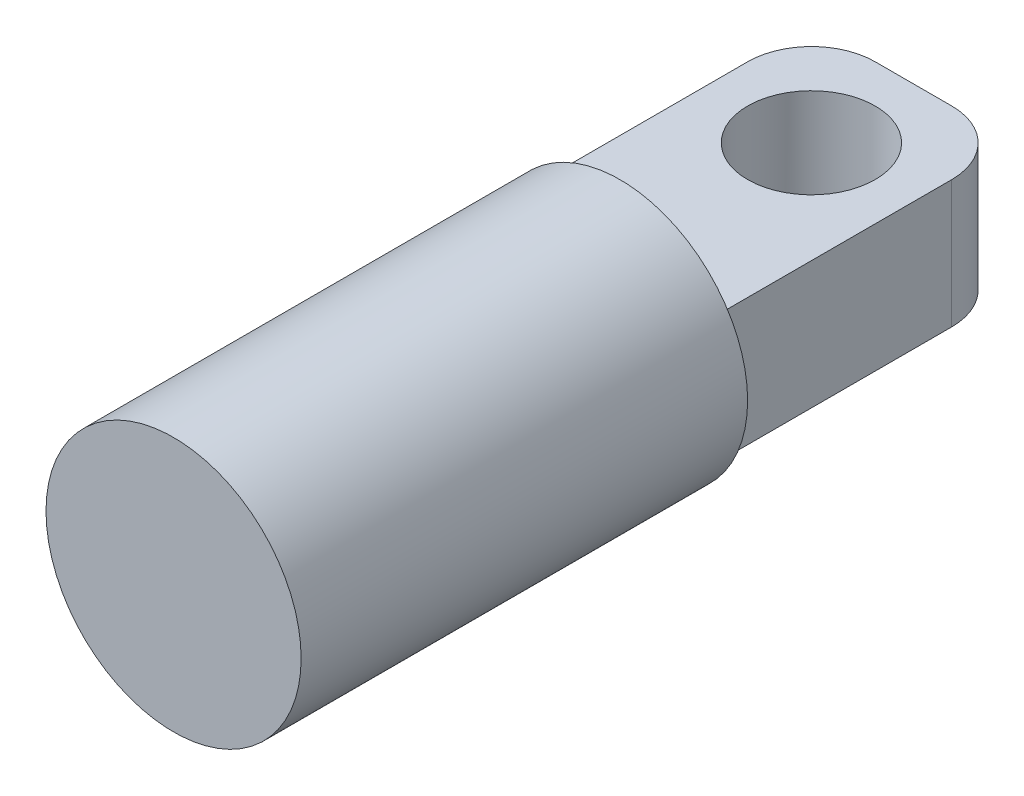
ISO-10303-21;
HEADER;
FILE_DESCRIPTION(('STEP AP214'),'2;1');
FILE_NAME('part.step','',(''),(''),'','','');
FILE_SCHEMA(('AUTOMOTIVE_DESIGN { 1 0 10303 214 1 1 1 1 }'));
ENDSEC;
DATA;
#1=APPLICATION_CONTEXT('core data for automotive mechanical design processes');
#2=APPLICATION_PROTOCOL_DEFINITION('international standard','automotive_design',2000,#1);
#3=PRODUCT_CONTEXT('',#1,'mechanical');
#4=PRODUCT('Part','Part','',(#3));
#5=PRODUCT_RELATED_PRODUCT_CATEGORY('part','',(#4));
#6=PRODUCT_DEFINITION_FORMATION('','',#4);
#7=PRODUCT_DEFINITION_CONTEXT('part definition',#1,'design');
#8=PRODUCT_DEFINITION('design','',#6,#7);
#9=PRODUCT_DEFINITION_SHAPE('','',#8);
#10=(LENGTH_UNIT() NAMED_UNIT(*) SI_UNIT(.MILLI.,.METRE.));
#11=(NAMED_UNIT(*) PLANE_ANGLE_UNIT() SI_UNIT($,.RADIAN.));
#12=(NAMED_UNIT(*) SI_UNIT($,.STERADIAN.) SOLID_ANGLE_UNIT());
#13=UNCERTAINTY_MEASURE_WITH_UNIT(LENGTH_MEASURE(1.E-05),#10,'distance_accuracy_value','');
#14=(GEOMETRIC_REPRESENTATION_CONTEXT(3) GLOBAL_UNCERTAINTY_ASSIGNED_CONTEXT((#13)) GLOBAL_UNIT_ASSIGNED_CONTEXT((#10,
#11,#12)) REPRESENTATION_CONTEXT('',''));
#15=CARTESIAN_POINT('',(0.,0.,0.));
#16=DIRECTION('',(0.,0.,1.));
#17=DIRECTION('',(1.,0.,0.));
#18=AXIS2_PLACEMENT_3D('',#15,#16,#17);
#19=CARTESIAN_POINT('',(0.,0.,-88.9));
#20=DIRECTION('',(0.,0.,1.));
#21=DIRECTION('',(1.,0.,0.));
#22=AXIS2_PLACEMENT_3D('',#19,#20,#21);
#23=CYLINDRICAL_SURFACE('',#22,25.4);
#24=CARTESIAN_POINT('',(0.,0.,-88.9));
#25=DIRECTION('',(0.,0.,1.));
#26=DIRECTION('',(1.,0.,0.));
#27=AXIS2_PLACEMENT_3D('',#24,#25,#26);
#28=CIRCLE('',#27,25.4);
#29=CARTESIAN_POINT('',(25.4,0.,-88.9));
#30=VERTEX_POINT('',#29);
#31=EDGE_CURVE('E121',#30,#30,#28,.T.);
#32=ORIENTED_EDGE('',*,*,#31,.T.);
#33=EDGE_LOOP('',(#32));
#34=FACE_BOUND('',#33,.T.);
#35=CARTESIAN_POINT('',(0.,0.,0.));
#36=DIRECTION('',(0.,0.,1.));
#37=DIRECTION('',(1.,0.,0.));
#38=AXIS2_PLACEMENT_3D('',#35,#36,#37);
#39=CIRCLE('',#38,25.4);
#40=CARTESIAN_POINT('',(25.4,0.,0.));
#41=VERTEX_POINT('',#40);
#42=EDGE_CURVE('E117',#41,#41,#39,.T.);
#43=ORIENTED_EDGE('',*,*,#42,.F.);
#44=EDGE_LOOP('',(#43));
#45=FACE_BOUND('',#44,.T.);
#46=ADVANCED_FACE('F36',(#34,#45),#23,.T.);
#47=CARTESIAN_POINT('',(0.,0.,-88.9));
#48=DIRECTION('',(0.,0.,1.));
#49=DIRECTION('',(1.,0.,0.));
#50=AXIS2_PLACEMENT_3D('',#47,#48,#49);
#51=PLANE('',#50);
#52=DIRECTION('',(0.,1.,0.));
#53=VECTOR('',#52,1.);
#54=CARTESIAN_POINT('',(-20.32,0.,-88.9));
#55=LINE('',#54,#53);
#56=CARTESIAN_POINT('',(-20.32,-12.7,-88.9));
#57=VERTEX_POINT('',#56);
#58=CARTESIAN_POINT('',(-20.32,12.7,-88.9));
#59=VERTEX_POINT('',#58);
#60=EDGE_CURVE('E94',#57,#59,#55,.T.);
#61=ORIENTED_EDGE('',*,*,#60,.F.);
#62=DIRECTION('',(1.,0.,0.));
#63=VECTOR('',#62,1.);
#64=CARTESIAN_POINT('',(-20.32,-12.7,-88.9));
#65=LINE('',#64,#63);
#66=CARTESIAN_POINT('',(20.32,-12.7,-88.9));
#67=VERTEX_POINT('',#66);
#68=EDGE_CURVE('E102',#57,#67,#65,.T.);
#69=ORIENTED_EDGE('',*,*,#68,.T.);
#70=DIRECTION('',(0.,1.,0.));
#71=VECTOR('',#70,1.);
#72=CARTESIAN_POINT('',(20.32,0.,-88.9));
#73=LINE('',#72,#71);
#74=CARTESIAN_POINT('',(20.32,12.7,-88.9));
#75=VERTEX_POINT('',#74);
#76=EDGE_CURVE('E97',#67,#75,#73,.T.);
#77=ORIENTED_EDGE('',*,*,#76,.T.);
#78=DIRECTION('',(1.,0.,0.));
#79=VECTOR('',#78,1.);
#80=CARTESIAN_POINT('',(-20.32,12.7,-88.9));
#81=LINE('',#80,#79);
#82=EDGE_CURVE('E90',#59,#75,#81,.T.);
#83=ORIENTED_EDGE('',*,*,#82,.F.);
#84=EDGE_LOOP('',(#61,#69,#77,#83));
#85=FACE_BOUND('',#84,.T.);
#86=ORIENTED_EDGE('',*,*,#31,.F.);
#87=EDGE_LOOP('',(#86));
#88=FACE_BOUND('',#87,.T.);
#89=ADVANCED_FACE('F92',(#85,#88),#51,.F.);
#90=CARTESIAN_POINT('',(0.,0.,0.));
#91=DIRECTION('',(0.,0.,1.));
#92=DIRECTION('',(1.,0.,0.));
#93=AXIS2_PLACEMENT_3D('',#90,#91,#92);
#94=PLANE('',#93);
#95=ORIENTED_EDGE('',*,*,#42,.T.);
#96=EDGE_LOOP('',(#95));
#97=FACE_BOUND('',#96,.T.);
#98=ADVANCED_FACE('F169',(#97),#94,.T.);
#99=CARTESIAN_POINT('',(-20.32,-12.7,0.));
#100=DIRECTION('',(0.,-1.,0.));
#101=DIRECTION('',(0.,0.,-1.));
#102=AXIS2_PLACEMENT_3D('',#99,#100,#101);
#103=PLANE('',#102);
#104=CARTESIAN_POINT('',(0.,-12.7,-127.));
#105=DIRECTION('',(0.,-1.,0.));
#106=DIRECTION('',(0.,0.,-1.));
#107=AXIS2_PLACEMENT_3D('',#104,#105,#106);
#108=CIRCLE('',#107,12.7);
#109=CARTESIAN_POINT('',(0.,-12.7,-139.7));
#110=VERTEX_POINT('',#109);
#111=EDGE_CURVE('E148',#110,#110,#108,.T.);
#112=ORIENTED_EDGE('',*,*,#111,.F.);
#113=EDGE_LOOP('',(#112));
#114=FACE_BOUND('',#113,.T.);
#115=DIRECTION('',(1.,0.,0.));
#116=VECTOR('',#115,1.);
#117=CARTESIAN_POINT('',(-20.32,-12.7,-147.32));
#118=LINE('',#117,#116);
#119=CARTESIAN_POINT('',(-7.62,-12.7,-147.32));
#120=VERTEX_POINT('',#119);
#121=CARTESIAN_POINT('',(7.62,-12.7,-147.32));
#122=VERTEX_POINT('',#121);
#123=EDGE_CURVE('E108',#120,#122,#118,.T.);
#124=ORIENTED_EDGE('',*,*,#123,.T.);
#125=CARTESIAN_POINT('',(7.62,-12.7,-134.62));
#126=DIRECTION('',(0.,-1.,0.));
#127=DIRECTION('',(0.,0.,-1.));
#128=AXIS2_PLACEMENT_3D('',#125,#126,#127);
#129=CIRCLE('',#128,12.7);
#130=CARTESIAN_POINT('',(20.32,-12.7,-134.62));
#131=VERTEX_POINT('',#130);
#132=EDGE_CURVE('E44',#122,#131,#129,.T.);
#133=ORIENTED_EDGE('',*,*,#132,.T.);
#134=DIRECTION('',(0.,0.,-1.));
#135=VECTOR('',#134,1.);
#136=CARTESIAN_POINT('',(20.32,-12.7,0.));
#137=LINE('',#136,#135);
#138=EDGE_CURVE('E142',#67,#131,#137,.T.);
#139=ORIENTED_EDGE('',*,*,#138,.F.);
#140=ORIENTED_EDGE('',*,*,#68,.F.);
#141=DIRECTION('',(0.,0.,-1.));
#142=VECTOR('',#141,1.);
#143=CARTESIAN_POINT('',(-20.32,-12.7,0.));
#144=LINE('',#143,#142);
#145=CARTESIAN_POINT('',(-20.32,-12.7,-134.62));
#146=VERTEX_POINT('',#145);
#147=EDGE_CURVE('E107',#57,#146,#144,.T.);
#148=ORIENTED_EDGE('',*,*,#147,.T.);
#149=CARTESIAN_POINT('',(-7.62,-12.7,-134.62));
#150=DIRECTION('',(0.,-1.,0.));
#151=DIRECTION('',(0.,0.,-1.));
#152=AXIS2_PLACEMENT_3D('',#149,#150,#151);
#153=CIRCLE('',#152,12.7);
#154=EDGE_CURVE('E136',#146,#120,#153,.T.);
#155=ORIENTED_EDGE('',*,*,#154,.T.);
#156=EDGE_LOOP('',(#124,#133,#139,#140,#148,#155));
#157=FACE_BOUND('',#156,.T.);
#158=ADVANCED_FACE('F141',(#114,#157),#103,.T.);
#159=CARTESIAN_POINT('',(-20.32,12.7,0.));
#160=DIRECTION('',(0.,-1.,0.));
#161=DIRECTION('',(0.,0.,-1.));
#162=AXIS2_PLACEMENT_3D('',#159,#160,#161);
#163=PLANE('',#162);
#164=CARTESIAN_POINT('',(0.,12.7,-127.));
#165=DIRECTION('',(0.,1.,0.));
#166=DIRECTION('',(0.,0.,1.));
#167=AXIS2_PLACEMENT_3D('',#164,#165,#166);
#168=CIRCLE('',#167,12.7);
#169=CARTESIAN_POINT('',(0.,12.7,-114.3));
#170=VERTEX_POINT('',#169);
#171=EDGE_CURVE('E251',#170,#170,#168,.T.);
#172=ORIENTED_EDGE('',*,*,#171,.F.);
#173=EDGE_LOOP('',(#172));
#174=FACE_BOUND('',#173,.T.);
#175=DIRECTION('',(0.,0.,-1.));
#176=VECTOR('',#175,1.);
#177=CARTESIAN_POINT('',(20.32,12.7,0.));
#178=LINE('',#177,#176);
#179=CARTESIAN_POINT('',(20.32,12.7,-134.62));
#180=VERTEX_POINT('',#179);
#181=EDGE_CURVE('E147',#75,#180,#178,.T.);
#182=ORIENTED_EDGE('',*,*,#181,.T.);
#183=CARTESIAN_POINT('',(7.62,12.7,-134.62));
#184=DIRECTION('',(0.,-1.,0.));
#185=DIRECTION('',(0.,0.,-1.));
#186=AXIS2_PLACEMENT_3D('',#183,#184,#185);
#187=CIRCLE('',#186,12.7);
#188=CARTESIAN_POINT('',(7.62,12.7,-147.32));
#189=VERTEX_POINT('',#188);
#190=EDGE_CURVE('E130',#180,#189,#187,.F.);
#191=ORIENTED_EDGE('',*,*,#190,.T.);
#192=DIRECTION('',(1.,0.,0.));
#193=VECTOR('',#192,1.);
#194=CARTESIAN_POINT('',(-20.32,12.7,-147.32));
#195=LINE('',#194,#193);
#196=CARTESIAN_POINT('',(-7.62,12.7,-147.32));
#197=VERTEX_POINT('',#196);
#198=EDGE_CURVE('E103',#197,#189,#195,.T.);
#199=ORIENTED_EDGE('',*,*,#198,.F.);
#200=CARTESIAN_POINT('',(-7.62,12.7,-134.62));
#201=DIRECTION('',(0.,-1.,0.));
#202=DIRECTION('',(0.,0.,-1.));
#203=AXIS2_PLACEMENT_3D('',#200,#201,#202);
#204=CIRCLE('',#203,12.7);
#205=CARTESIAN_POINT('',(-20.32,12.7,-134.62));
#206=VERTEX_POINT('',#205);
#207=EDGE_CURVE('E112',#197,#206,#204,.F.);
#208=ORIENTED_EDGE('',*,*,#207,.T.);
#209=DIRECTION('',(0.,0.,-1.));
#210=VECTOR('',#209,1.);
#211=CARTESIAN_POINT('',(-20.32,12.7,0.));
#212=LINE('',#211,#210);
#213=EDGE_CURVE('E106',#59,#206,#212,.T.);
#214=ORIENTED_EDGE('',*,*,#213,.F.);
#215=ORIENTED_EDGE('',*,*,#82,.T.);
#216=EDGE_LOOP('',(#182,#191,#199,#208,#214,#215));
#217=FACE_BOUND('',#216,.T.);
#218=ADVANCED_FACE('F110',(#174,#217),#163,.F.);
#219=CARTESIAN_POINT('',(-20.32,0.,-147.32));
#220=DIRECTION('',(0.,0.,-1.));
#221=DIRECTION('',(-1.,0.,0.));
#222=AXIS2_PLACEMENT_3D('',#219,#220,#221);
#223=PLANE('',#222);
#224=ORIENTED_EDGE('',*,*,#198,.T.);
#225=DIRECTION('',(0.,1.,0.));
#226=VECTOR('',#225,1.);
#227=CARTESIAN_POINT('',(7.62,0.,-147.32));
#228=LINE('',#227,#226);
#229=EDGE_CURVE('E57',#189,#122,#228,.F.);
#230=ORIENTED_EDGE('',*,*,#229,.T.);
#231=ORIENTED_EDGE('',*,*,#123,.F.);
#232=DIRECTION('',(0.,1.,0.));
#233=VECTOR('',#232,1.);
#234=CARTESIAN_POINT('',(-7.62,12.7,-147.32));
#235=LINE('',#234,#233);
#236=EDGE_CURVE('E132',#120,#197,#235,.T.);
#237=ORIENTED_EDGE('',*,*,#236,.T.);
#238=EDGE_LOOP('',(#224,#230,#231,#237));
#239=FACE_BOUND('',#238,.T.);
#240=ADVANCED_FACE('F151',(#239),#223,.T.);
#241=CARTESIAN_POINT('',(-20.32,0.,0.));
#242=DIRECTION('',(1.,0.,0.));
#243=DIRECTION('',(0.,0.,-1.));
#244=AXIS2_PLACEMENT_3D('',#241,#242,#243);
#245=PLANE('',#244);
#246=ORIENTED_EDGE('',*,*,#213,.T.);
#247=DIRECTION('',(0.,1.,0.));
#248=VECTOR('',#247,1.);
#249=CARTESIAN_POINT('',(-20.32,-12.7,-134.62));
#250=LINE('',#249,#248);
#251=EDGE_CURVE('E11',#206,#146,#250,.F.);
#252=ORIENTED_EDGE('',*,*,#251,.T.);
#253=ORIENTED_EDGE('',*,*,#147,.F.);
#254=ORIENTED_EDGE('',*,*,#60,.T.);
#255=EDGE_LOOP('',(#246,#252,#253,#254));
#256=FACE_BOUND('',#255,.T.);
#257=ADVANCED_FACE('F105',(#256),#245,.F.);
#258=CARTESIAN_POINT('',(20.32,0.,0.));
#259=DIRECTION('',(1.,0.,0.));
#260=DIRECTION('',(0.,0.,-1.));
#261=AXIS2_PLACEMENT_3D('',#258,#259,#260);
#262=PLANE('',#261);
#263=ORIENTED_EDGE('',*,*,#138,.T.);
#264=DIRECTION('',(0.,1.,0.));
#265=VECTOR('',#264,1.);
#266=CARTESIAN_POINT('',(20.32,0.,-134.62));
#267=LINE('',#266,#265);
#268=EDGE_CURVE('E124',#131,#180,#267,.T.);
#269=ORIENTED_EDGE('',*,*,#268,.T.);
#270=ORIENTED_EDGE('',*,*,#181,.F.);
#271=ORIENTED_EDGE('',*,*,#76,.F.);
#272=EDGE_LOOP('',(#263,#269,#270,#271));
#273=FACE_BOUND('',#272,.T.);
#274=ADVANCED_FACE('F146',(#273),#262,.T.);
#275=CARTESIAN_POINT('',(7.62,0.,-134.62));
#276=DIRECTION('',(0.,1.,0.));
#277=DIRECTION('',(0.,0.,1.));
#278=AXIS2_PLACEMENT_3D('',#275,#276,#277);
#279=CYLINDRICAL_SURFACE('',#278,12.7);
#280=ORIENTED_EDGE('',*,*,#132,.F.);
#281=ORIENTED_EDGE('',*,*,#229,.F.);
#282=ORIENTED_EDGE('',*,*,#190,.F.);
#283=ORIENTED_EDGE('',*,*,#268,.F.);
#284=EDGE_LOOP('',(#280,#281,#282,#283));
#285=FACE_BOUND('',#284,.T.);
#286=ADVANCED_FACE('F150',(#285),#279,.T.);
#287=CARTESIAN_POINT('',(-7.62,0.,-134.62));
#288=DIRECTION('',(0.,-1.,0.));
#289=DIRECTION('',(0.,0.,-1.));
#290=AXIS2_PLACEMENT_3D('',#287,#288,#289);
#291=CYLINDRICAL_SURFACE('',#290,12.7);
#292=ORIENTED_EDGE('',*,*,#154,.F.);
#293=ORIENTED_EDGE('',*,*,#251,.F.);
#294=ORIENTED_EDGE('',*,*,#207,.F.);
#295=ORIENTED_EDGE('',*,*,#236,.F.);
#296=EDGE_LOOP('',(#292,#293,#294,#295));
#297=FACE_BOUND('',#296,.T.);
#298=ADVANCED_FACE('F38',(#297),#291,.T.);
#299=CARTESIAN_POINT('',(0.,-25.4,-127.));
#300=DIRECTION('',(0.,1.,0.));
#301=DIRECTION('',(0.,0.,1.));
#302=AXIS2_PLACEMENT_3D('',#299,#300,#301);
#303=CYLINDRICAL_SURFACE('',#302,12.7);
#304=ORIENTED_EDGE('',*,*,#111,.T.);
#305=EDGE_LOOP('',(#304));
#306=FACE_BOUND('',#305,.T.);
#307=ORIENTED_EDGE('',*,*,#171,.T.);
#308=EDGE_LOOP('',(#307));
#309=FACE_BOUND('',#308,.T.);
#310=ADVANCED_FACE('F156',(#306,#309),#303,.F.);
#311=CLOSED_SHELL('',(#46,#89,#98,#158,#218,#240,#257,#274,#286,#298,#310));
#312=MANIFOLD_SOLID_BREP('B2',#311);
#313=ADVANCED_BREP_SHAPE_REPRESENTATION('',(#18,#312),#14);
#314=SHAPE_DEFINITION_REPRESENTATION(#9,#313);
ENDSEC;
END-ISO-10303-21;
